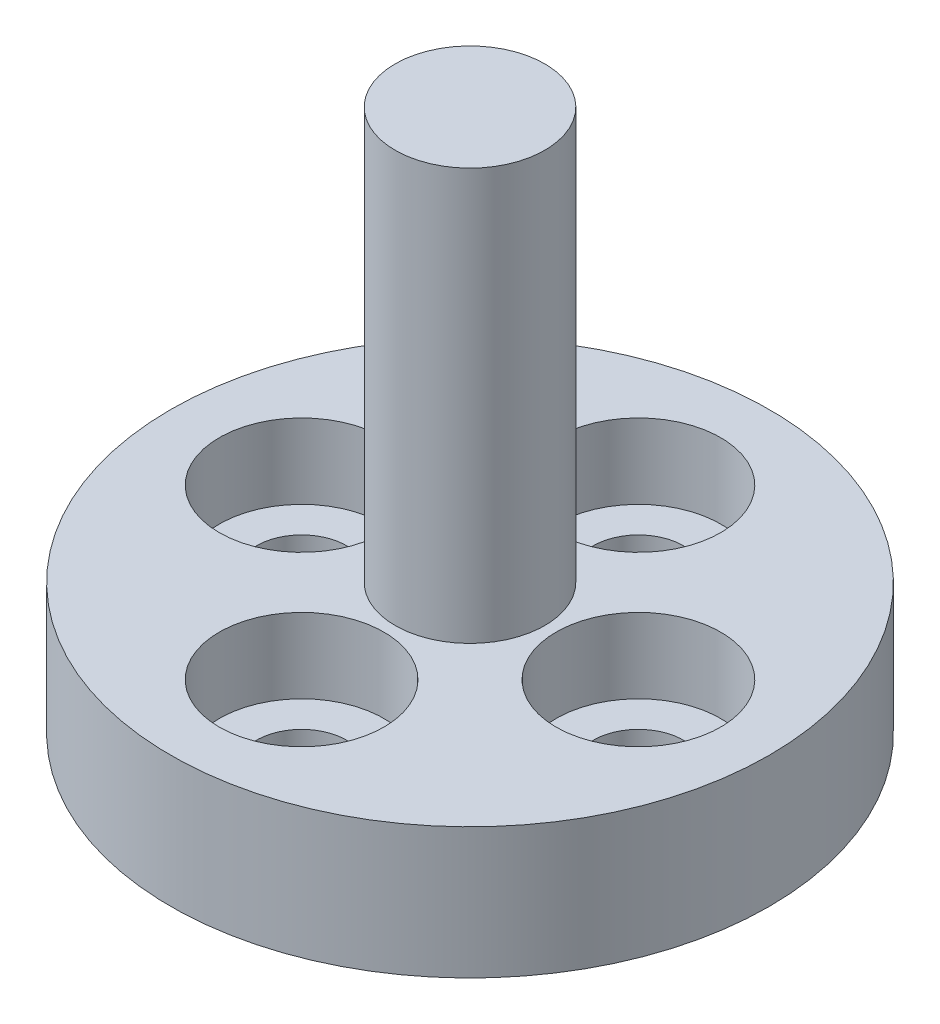
ISO-10303-21;
HEADER;
FILE_DESCRIPTION(('STEP AP214'),'2;1');
FILE_NAME('part.step','',(''),(''),'','','');
FILE_SCHEMA(('AUTOMOTIVE_DESIGN { 1 0 10303 214 1 1 1 1 }'));
ENDSEC;
DATA;
#1=APPLICATION_CONTEXT('core data for automotive mechanical design processes');
#2=APPLICATION_PROTOCOL_DEFINITION('international standard','automotive_design',2000,#1);
#3=PRODUCT_CONTEXT('',#1,'mechanical');
#4=PRODUCT('Part','Part','',(#3));
#5=PRODUCT_RELATED_PRODUCT_CATEGORY('part','',(#4));
#6=PRODUCT_DEFINITION_FORMATION('','',#4);
#7=PRODUCT_DEFINITION_CONTEXT('part definition',#1,'design');
#8=PRODUCT_DEFINITION('design','',#6,#7);
#9=PRODUCT_DEFINITION_SHAPE('','',#8);
#10=(LENGTH_UNIT() NAMED_UNIT(*) SI_UNIT(.MILLI.,.METRE.));
#11=(NAMED_UNIT(*) PLANE_ANGLE_UNIT() SI_UNIT($,.RADIAN.));
#12=(NAMED_UNIT(*) SI_UNIT($,.STERADIAN.) SOLID_ANGLE_UNIT());
#13=UNCERTAINTY_MEASURE_WITH_UNIT(LENGTH_MEASURE(1.E-05),#10,'distance_accuracy_value','');
#14=(GEOMETRIC_REPRESENTATION_CONTEXT(3) GLOBAL_UNCERTAINTY_ASSIGNED_CONTEXT((#13)) GLOBAL_UNIT_ASSIGNED_CONTEXT((#10,
#11,#12)) REPRESENTATION_CONTEXT('',''));
#15=CARTESIAN_POINT('',(0.,0.,0.));
#16=DIRECTION('',(0.,0.,1.));
#17=DIRECTION('',(1.,0.,0.));
#18=AXIS2_PLACEMENT_3D('',#15,#16,#17);
#19=CARTESIAN_POINT('',(0.,14.5,0.));
#20=DIRECTION('',(0.,-1.,0.));
#21=DIRECTION('',(1.,0.,0.));
#22=AXIS2_PLACEMENT_3D('',#19,#20,#21);
#23=PLANE('',#22);
#24=CARTESIAN_POINT('',(0.,14.5,0.));
#25=DIRECTION('',(0.,1.,0.));
#26=DIRECTION('',(-1.,0.,0.));
#27=AXIS2_PLACEMENT_3D('',#24,#25,#26);
#28=CIRCLE('',#27,2.);
#29=CARTESIAN_POINT('',(-2.,14.5,0.));
#30=VERTEX_POINT('',#29);
#31=EDGE_CURVE('E10',#30,#30,#28,.T.);
#32=ORIENTED_EDGE('',*,*,#31,.T.);
#33=EDGE_LOOP('',(#32));
#34=FACE_BOUND('',#33,.T.);
#35=ADVANCED_FACE('F31',(#34),#23,.F.);
#36=CARTESIAN_POINT('',(0.,14.5,0.));
#37=DIRECTION('',(0.,1.,0.));
#38=DIRECTION('',(-1.,0.,0.));
#39=AXIS2_PLACEMENT_3D('',#36,#37,#38);
#40=CYLINDRICAL_SURFACE('',#39,2.);
#41=ORIENTED_EDGE('',*,*,#31,.F.);
#42=EDGE_LOOP('',(#41));
#43=FACE_BOUND('',#42,.T.);
#44=CARTESIAN_POINT('',(0.,3.5,0.));
#45=DIRECTION('',(0.,1.,0.));
#46=DIRECTION('',(-1.,0.,0.));
#47=AXIS2_PLACEMENT_3D('',#44,#45,#46);
#48=CIRCLE('',#47,2.);
#49=CARTESIAN_POINT('',(-2.,3.5,0.));
#50=VERTEX_POINT('',#49);
#51=EDGE_CURVE('E37',#50,#50,#48,.T.);
#52=ORIENTED_EDGE('',*,*,#51,.T.);
#53=EDGE_LOOP('',(#52));
#54=FACE_BOUND('',#53,.T.);
#55=ADVANCED_FACE('F105',(#43,#54),#40,.T.);
#56=CARTESIAN_POINT('',(8.,3.5,0.));
#57=DIRECTION('',(0.,-1.,0.));
#58=DIRECTION('',(1.,0.,0.));
#59=AXIS2_PLACEMENT_3D('',#56,#57,#58);
#60=PLANE('',#59);
#61=CARTESIAN_POINT('',(-4.5,3.5,0.));
#62=DIRECTION('',(0.,1.,0.));
#63=DIRECTION('',(0.,0.,1.));
#64=AXIS2_PLACEMENT_3D('',#61,#62,#63);
#65=CIRCLE('',#64,2.2);
#66=CARTESIAN_POINT('',(-4.5,3.5,2.2));
#67=VERTEX_POINT('',#66);
#68=EDGE_CURVE('E95',#67,#67,#65,.T.);
#69=ORIENTED_EDGE('',*,*,#68,.F.);
#70=EDGE_LOOP('',(#69));
#71=FACE_BOUND('',#70,.T.);
#72=CARTESIAN_POINT('',(0.,3.5,-4.5));
#73=DIRECTION('',(0.,1.,0.));
#74=DIRECTION('',(0.,0.,1.));
#75=AXIS2_PLACEMENT_3D('',#72,#73,#74);
#76=CIRCLE('',#75,2.2);
#77=CARTESIAN_POINT('',(0.,3.5,-2.3));
#78=VERTEX_POINT('',#77);
#79=EDGE_CURVE('E83',#78,#78,#76,.T.);
#80=ORIENTED_EDGE('',*,*,#79,.F.);
#81=EDGE_LOOP('',(#80));
#82=FACE_BOUND('',#81,.T.);
#83=CARTESIAN_POINT('',(4.5,3.5,0.));
#84=DIRECTION('',(0.,1.,0.));
#85=DIRECTION('',(0.,0.,1.));
#86=AXIS2_PLACEMENT_3D('',#83,#84,#85);
#87=CIRCLE('',#86,2.2);
#88=CARTESIAN_POINT('',(4.5,3.5,2.2));
#89=VERTEX_POINT('',#88);
#90=EDGE_CURVE('E71',#89,#89,#87,.T.);
#91=ORIENTED_EDGE('',*,*,#90,.F.);
#92=EDGE_LOOP('',(#91));
#93=FACE_BOUND('',#92,.T.);
#94=CARTESIAN_POINT('',(0.,3.5,4.5));
#95=DIRECTION('',(0.,1.,0.));
#96=DIRECTION('',(0.,0.,1.));
#97=AXIS2_PLACEMENT_3D('',#94,#95,#96);
#98=CIRCLE('',#97,2.2);
#99=CARTESIAN_POINT('',(0.,3.5,6.7));
#100=VERTEX_POINT('',#99);
#101=EDGE_CURVE('E59',#100,#100,#98,.T.);
#102=ORIENTED_EDGE('',*,*,#101,.F.);
#103=EDGE_LOOP('',(#102));
#104=FACE_BOUND('',#103,.T.);
#105=ORIENTED_EDGE('',*,*,#51,.F.);
#106=EDGE_LOOP('',(#105));
#107=FACE_BOUND('',#106,.T.);
#108=CARTESIAN_POINT('',(0.,3.5,0.));
#109=DIRECTION('',(0.,1.,0.));
#110=DIRECTION('',(-1.,0.,0.));
#111=AXIS2_PLACEMENT_3D('',#108,#109,#110);
#112=CIRCLE('',#111,8.);
#113=CARTESIAN_POINT('',(-8.,3.5,0.));
#114=VERTEX_POINT('',#113);
#115=EDGE_CURVE('E41',#114,#114,#112,.T.);
#116=ORIENTED_EDGE('',*,*,#115,.T.);
#117=EDGE_LOOP('',(#116));
#118=FACE_BOUND('',#117,.T.);
#119=ADVANCED_FACE('F101',(#71,#82,#93,#104,#107,#118),#60,.F.);
#120=CARTESIAN_POINT('',(0.,14.5,0.));
#121=DIRECTION('',(0.,1.,0.));
#122=DIRECTION('',(-1.,0.,0.));
#123=AXIS2_PLACEMENT_3D('',#120,#121,#122);
#124=CYLINDRICAL_SURFACE('',#123,8.);
#125=ORIENTED_EDGE('',*,*,#115,.F.);
#126=EDGE_LOOP('',(#125));
#127=FACE_BOUND('',#126,.T.);
#128=CARTESIAN_POINT('',(0.,0.,0.));
#129=DIRECTION('',(0.,1.,0.));
#130=DIRECTION('',(-1.,0.,0.));
#131=AXIS2_PLACEMENT_3D('',#128,#129,#130);
#132=CIRCLE('',#131,8.);
#133=CARTESIAN_POINT('',(-8.,0.,0.));
#134=VERTEX_POINT('',#133);
#135=EDGE_CURVE('E45',#134,#134,#132,.T.);
#136=ORIENTED_EDGE('',*,*,#135,.T.);
#137=EDGE_LOOP('',(#136));
#138=FACE_BOUND('',#137,.T.);
#139=ADVANCED_FACE('F104',(#127,#138),#124,.T.);
#140=CARTESIAN_POINT('',(0.,0.,0.));
#141=DIRECTION('',(0.,1.,0.));
#142=DIRECTION('',(-1.,0.,0.));
#143=AXIS2_PLACEMENT_3D('',#140,#141,#142);
#144=PLANE('',#143);
#145=CARTESIAN_POINT('',(-4.5,0.,0.));
#146=DIRECTION('',(0.,1.,0.));
#147=DIRECTION('',(0.,0.,1.));
#148=AXIS2_PLACEMENT_3D('',#145,#146,#147);
#149=CIRCLE('',#148,1.2);
#150=CARTESIAN_POINT('',(-4.5,0.,1.2));
#151=VERTEX_POINT('',#150);
#152=EDGE_CURVE('E86',#151,#151,#149,.T.);
#153=ORIENTED_EDGE('',*,*,#152,.T.);
#154=EDGE_LOOP('',(#153));
#155=FACE_BOUND('',#154,.T.);
#156=CARTESIAN_POINT('',(0.,0.,-4.5));
#157=DIRECTION('',(0.,1.,0.));
#158=DIRECTION('',(0.,0.,1.));
#159=AXIS2_PLACEMENT_3D('',#156,#157,#158);
#160=CIRCLE('',#159,1.2);
#161=CARTESIAN_POINT('',(0.,0.,-3.3));
#162=VERTEX_POINT('',#161);
#163=EDGE_CURVE('E74',#162,#162,#160,.T.);
#164=ORIENTED_EDGE('',*,*,#163,.T.);
#165=EDGE_LOOP('',(#164));
#166=FACE_BOUND('',#165,.T.);
#167=CARTESIAN_POINT('',(4.5,0.,0.));
#168=DIRECTION('',(0.,1.,0.));
#169=DIRECTION('',(0.,0.,1.));
#170=AXIS2_PLACEMENT_3D('',#167,#168,#169);
#171=CIRCLE('',#170,1.2);
#172=CARTESIAN_POINT('',(4.5,0.,1.2));
#173=VERTEX_POINT('',#172);
#174=EDGE_CURVE('E62',#173,#173,#171,.T.);
#175=ORIENTED_EDGE('',*,*,#174,.T.);
#176=EDGE_LOOP('',(#175));
#177=FACE_BOUND('',#176,.T.);
#178=CARTESIAN_POINT('',(0.,0.,4.5));
#179=DIRECTION('',(0.,1.,0.));
#180=DIRECTION('',(0.,0.,1.));
#181=AXIS2_PLACEMENT_3D('',#178,#179,#180);
#182=CIRCLE('',#181,1.2);
#183=CARTESIAN_POINT('',(0.,0.,5.7));
#184=VERTEX_POINT('',#183);
#185=EDGE_CURVE('E50',#184,#184,#182,.T.);
#186=ORIENTED_EDGE('',*,*,#185,.T.);
#187=EDGE_LOOP('',(#186));
#188=FACE_BOUND('',#187,.T.);
#189=ORIENTED_EDGE('',*,*,#135,.F.);
#190=EDGE_LOOP('',(#189));
#191=FACE_BOUND('',#190,.T.);
#192=ADVANCED_FACE('F118',(#155,#166,#177,#188,#191),#144,.F.);
#193=CARTESIAN_POINT('',(0.,3.5,4.5));
#194=DIRECTION('',(0.,1.,0.));
#195=DIRECTION('',(0.,0.,1.));
#196=AXIS2_PLACEMENT_3D('',#193,#194,#195);
#197=CYLINDRICAL_SURFACE('',#196,1.2);
#198=ORIENTED_EDGE('',*,*,#185,.F.);
#199=EDGE_LOOP('',(#198));
#200=FACE_BOUND('',#199,.T.);
#201=CARTESIAN_POINT('',(0.,1.5,4.5));
#202=DIRECTION('',(0.,1.,0.));
#203=DIRECTION('',(0.,0.,1.));
#204=AXIS2_PLACEMENT_3D('',#201,#202,#203);
#205=CIRCLE('',#204,1.2);
#206=CARTESIAN_POINT('',(0.,1.5,5.7));
#207=VERTEX_POINT('',#206);
#208=EDGE_CURVE('E53',#207,#207,#205,.T.);
#209=ORIENTED_EDGE('',*,*,#208,.T.);
#210=EDGE_LOOP('',(#209));
#211=FACE_BOUND('',#210,.T.);
#212=ADVANCED_FACE('F123',(#200,#211),#197,.F.);
#213=CARTESIAN_POINT('',(1.2,1.5,4.5));
#214=DIRECTION('',(0.,-1.,0.));
#215=DIRECTION('',(0.,0.,-1.));
#216=AXIS2_PLACEMENT_3D('',#213,#214,#215);
#217=PLANE('',#216);
#218=ORIENTED_EDGE('',*,*,#208,.F.);
#219=EDGE_LOOP('',(#218));
#220=FACE_BOUND('',#219,.T.);
#221=CARTESIAN_POINT('',(0.,1.5,4.5));
#222=DIRECTION('',(0.,1.,0.));
#223=DIRECTION('',(0.,0.,1.));
#224=AXIS2_PLACEMENT_3D('',#221,#222,#223);
#225=CIRCLE('',#224,2.2);
#226=CARTESIAN_POINT('',(0.,1.5,6.7));
#227=VERTEX_POINT('',#226);
#228=EDGE_CURVE('E56',#227,#227,#225,.T.);
#229=ORIENTED_EDGE('',*,*,#228,.T.);
#230=EDGE_LOOP('',(#229));
#231=FACE_BOUND('',#230,.T.);
#232=ADVANCED_FACE('F130',(#220,#231),#217,.F.);
#233=CARTESIAN_POINT('',(0.,3.5,4.5));
#234=DIRECTION('',(0.,1.,0.));
#235=DIRECTION('',(0.,0.,1.));
#236=AXIS2_PLACEMENT_3D('',#233,#234,#235);
#237=CYLINDRICAL_SURFACE('',#236,2.2);
#238=ORIENTED_EDGE('',*,*,#228,.F.);
#239=EDGE_LOOP('',(#238));
#240=FACE_BOUND('',#239,.T.);
#241=ORIENTED_EDGE('',*,*,#101,.T.);
#242=EDGE_LOOP('',(#241));
#243=FACE_BOUND('',#242,.T.);
#244=ADVANCED_FACE('F164',(#240,#243),#237,.F.);
#245=CARTESIAN_POINT('',(4.5,3.5,0.));
#246=DIRECTION('',(0.,1.,0.));
#247=DIRECTION('',(0.,0.,1.));
#248=AXIS2_PLACEMENT_3D('',#245,#246,#247);
#249=CYLINDRICAL_SURFACE('',#248,1.2);
#250=ORIENTED_EDGE('',*,*,#174,.F.);
#251=EDGE_LOOP('',(#250));
#252=FACE_BOUND('',#251,.T.);
#253=CARTESIAN_POINT('',(4.5,1.5,0.));
#254=DIRECTION('',(0.,1.,0.));
#255=DIRECTION('',(0.,0.,1.));
#256=AXIS2_PLACEMENT_3D('',#253,#254,#255);
#257=CIRCLE('',#256,1.2);
#258=CARTESIAN_POINT('',(4.5,1.5,1.2));
#259=VERTEX_POINT('',#258);
#260=EDGE_CURVE('E65',#259,#259,#257,.T.);
#261=ORIENTED_EDGE('',*,*,#260,.T.);
#262=EDGE_LOOP('',(#261));
#263=FACE_BOUND('',#262,.T.);
#264=ADVANCED_FACE('F172',(#252,#263),#249,.F.);
#265=CARTESIAN_POINT('',(5.7,1.5,0.));
#266=DIRECTION('',(0.,-1.,0.));
#267=DIRECTION('',(0.,0.,-1.));
#268=AXIS2_PLACEMENT_3D('',#265,#266,#267);
#269=PLANE('',#268);
#270=ORIENTED_EDGE('',*,*,#260,.F.);
#271=EDGE_LOOP('',(#270));
#272=FACE_BOUND('',#271,.T.);
#273=CARTESIAN_POINT('',(4.5,1.5,0.));
#274=DIRECTION('',(0.,1.,0.));
#275=DIRECTION('',(0.,0.,1.));
#276=AXIS2_PLACEMENT_3D('',#273,#274,#275);
#277=CIRCLE('',#276,2.2);
#278=CARTESIAN_POINT('',(4.5,1.5,2.2));
#279=VERTEX_POINT('',#278);
#280=EDGE_CURVE('E68',#279,#279,#277,.T.);
#281=ORIENTED_EDGE('',*,*,#280,.T.);
#282=EDGE_LOOP('',(#281));
#283=FACE_BOUND('',#282,.T.);
#284=ADVANCED_FACE('F180',(#272,#283),#269,.F.);
#285=CARTESIAN_POINT('',(4.5,3.5,0.));
#286=DIRECTION('',(0.,1.,0.));
#287=DIRECTION('',(0.,0.,1.));
#288=AXIS2_PLACEMENT_3D('',#285,#286,#287);
#289=CYLINDRICAL_SURFACE('',#288,2.2);
#290=ORIENTED_EDGE('',*,*,#280,.F.);
#291=EDGE_LOOP('',(#290));
#292=FACE_BOUND('',#291,.T.);
#293=ORIENTED_EDGE('',*,*,#90,.T.);
#294=EDGE_LOOP('',(#293));
#295=FACE_BOUND('',#294,.T.);
#296=ADVANCED_FACE('F188',(#292,#295),#289,.F.);
#297=CARTESIAN_POINT('',(0.,3.5,-4.5));
#298=DIRECTION('',(0.,1.,0.));
#299=DIRECTION('',(0.,0.,1.));
#300=AXIS2_PLACEMENT_3D('',#297,#298,#299);
#301=CYLINDRICAL_SURFACE('',#300,1.2);
#302=ORIENTED_EDGE('',*,*,#163,.F.);
#303=EDGE_LOOP('',(#302));
#304=FACE_BOUND('',#303,.T.);
#305=CARTESIAN_POINT('',(0.,1.5,-4.5));
#306=DIRECTION('',(0.,1.,0.));
#307=DIRECTION('',(0.,0.,1.));
#308=AXIS2_PLACEMENT_3D('',#305,#306,#307);
#309=CIRCLE('',#308,1.2);
#310=CARTESIAN_POINT('',(0.,1.5,-3.3));
#311=VERTEX_POINT('',#310);
#312=EDGE_CURVE('E77',#311,#311,#309,.T.);
#313=ORIENTED_EDGE('',*,*,#312,.T.);
#314=EDGE_LOOP('',(#313));
#315=FACE_BOUND('',#314,.T.);
#316=ADVANCED_FACE('F196',(#304,#315),#301,.F.);
#317=CARTESIAN_POINT('',(1.2,1.5,-4.5));
#318=DIRECTION('',(0.,-1.,0.));
#319=DIRECTION('',(0.,0.,-1.));
#320=AXIS2_PLACEMENT_3D('',#317,#318,#319);
#321=PLANE('',#320);
#322=ORIENTED_EDGE('',*,*,#312,.F.);
#323=EDGE_LOOP('',(#322));
#324=FACE_BOUND('',#323,.T.);
#325=CARTESIAN_POINT('',(0.,1.5,-4.5));
#326=DIRECTION('',(0.,1.,0.));
#327=DIRECTION('',(0.,0.,1.));
#328=AXIS2_PLACEMENT_3D('',#325,#326,#327);
#329=CIRCLE('',#328,2.2);
#330=CARTESIAN_POINT('',(0.,1.5,-2.3));
#331=VERTEX_POINT('',#330);
#332=EDGE_CURVE('E80',#331,#331,#329,.T.);
#333=ORIENTED_EDGE('',*,*,#332,.T.);
#334=EDGE_LOOP('',(#333));
#335=FACE_BOUND('',#334,.T.);
#336=ADVANCED_FACE('F204',(#324,#335),#321,.F.);
#337=CARTESIAN_POINT('',(0.,3.5,-4.5));
#338=DIRECTION('',(0.,1.,0.));
#339=DIRECTION('',(0.,0.,1.));
#340=AXIS2_PLACEMENT_3D('',#337,#338,#339);
#341=CYLINDRICAL_SURFACE('',#340,2.2);
#342=ORIENTED_EDGE('',*,*,#332,.F.);
#343=EDGE_LOOP('',(#342));
#344=FACE_BOUND('',#343,.T.);
#345=ORIENTED_EDGE('',*,*,#79,.T.);
#346=EDGE_LOOP('',(#345));
#347=FACE_BOUND('',#346,.T.);
#348=ADVANCED_FACE('F212',(#344,#347),#341,.F.);
#349=CARTESIAN_POINT('',(-4.5,3.5,0.));
#350=DIRECTION('',(0.,1.,0.));
#351=DIRECTION('',(0.,0.,1.));
#352=AXIS2_PLACEMENT_3D('',#349,#350,#351);
#353=CYLINDRICAL_SURFACE('',#352,1.2);
#354=ORIENTED_EDGE('',*,*,#152,.F.);
#355=EDGE_LOOP('',(#354));
#356=FACE_BOUND('',#355,.T.);
#357=CARTESIAN_POINT('',(-4.5,1.5,0.));
#358=DIRECTION('',(0.,1.,0.));
#359=DIRECTION('',(0.,0.,1.));
#360=AXIS2_PLACEMENT_3D('',#357,#358,#359);
#361=CIRCLE('',#360,1.2);
#362=CARTESIAN_POINT('',(-4.5,1.5,1.2));
#363=VERTEX_POINT('',#362);
#364=EDGE_CURVE('E89',#363,#363,#361,.T.);
#365=ORIENTED_EDGE('',*,*,#364,.T.);
#366=EDGE_LOOP('',(#365));
#367=FACE_BOUND('',#366,.T.);
#368=ADVANCED_FACE('F220',(#356,#367),#353,.F.);
#369=CARTESIAN_POINT('',(-3.3,1.5,0.));
#370=DIRECTION('',(0.,-1.,0.));
#371=DIRECTION('',(0.,0.,-1.));
#372=AXIS2_PLACEMENT_3D('',#369,#370,#371);
#373=PLANE('',#372);
#374=ORIENTED_EDGE('',*,*,#364,.F.);
#375=EDGE_LOOP('',(#374));
#376=FACE_BOUND('',#375,.T.);
#377=CARTESIAN_POINT('',(-4.5,1.5,0.));
#378=DIRECTION('',(0.,1.,0.));
#379=DIRECTION('',(0.,0.,1.));
#380=AXIS2_PLACEMENT_3D('',#377,#378,#379);
#381=CIRCLE('',#380,2.2);
#382=CARTESIAN_POINT('',(-4.5,1.5,2.2));
#383=VERTEX_POINT('',#382);
#384=EDGE_CURVE('E92',#383,#383,#381,.T.);
#385=ORIENTED_EDGE('',*,*,#384,.T.);
#386=EDGE_LOOP('',(#385));
#387=FACE_BOUND('',#386,.T.);
#388=ADVANCED_FACE('F228',(#376,#387),#373,.F.);
#389=CARTESIAN_POINT('',(-4.5,3.5,0.));
#390=DIRECTION('',(0.,1.,0.));
#391=DIRECTION('',(0.,0.,1.));
#392=AXIS2_PLACEMENT_3D('',#389,#390,#391);
#393=CYLINDRICAL_SURFACE('',#392,2.2);
#394=ORIENTED_EDGE('',*,*,#384,.F.);
#395=EDGE_LOOP('',(#394));
#396=FACE_BOUND('',#395,.T.);
#397=ORIENTED_EDGE('',*,*,#68,.T.);
#398=EDGE_LOOP('',(#397));
#399=FACE_BOUND('',#398,.T.);
#400=ADVANCED_FACE('F99',(#396,#399),#393,.F.);
#401=CLOSED_SHELL('',(#35,#55,#119,#139,#192,#212,#232,#244,#264,#284,#296,#316,#336,#348,#368,
#388,#400));
#402=MANIFOLD_SOLID_BREP('B2',#401);
#403=ADVANCED_BREP_SHAPE_REPRESENTATION('',(#18,#402),#14);
#404=SHAPE_DEFINITION_REPRESENTATION(#9,#403);
ENDSEC;
END-ISO-10303-21;
